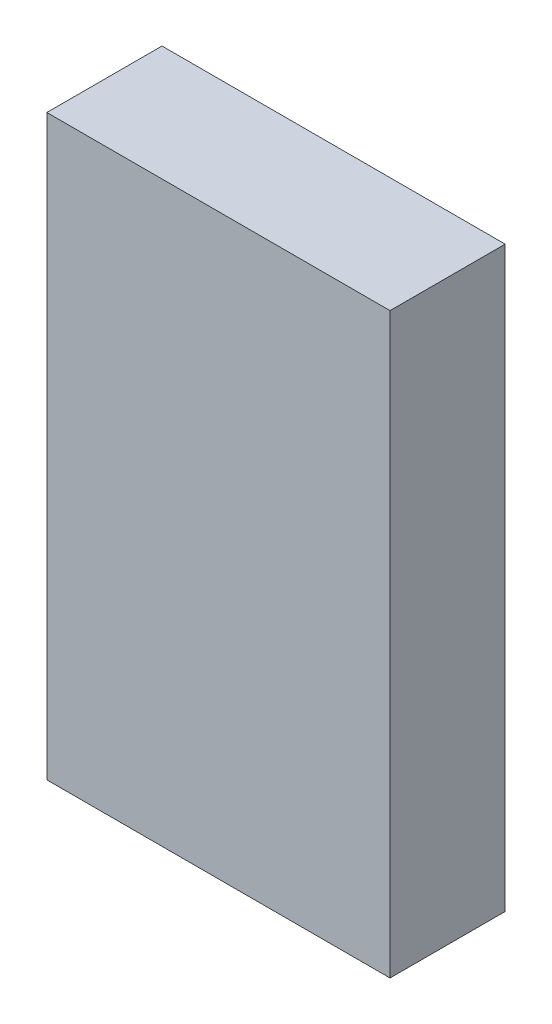
ISO-10303-21;
HEADER;
FILE_DESCRIPTION(('STEP AP214'),'2;1');
FILE_NAME('part.step','',(''),(''),'','','');
FILE_SCHEMA(('AUTOMOTIVE_DESIGN { 1 0 10303 214 1 1 1 1 }'));
ENDSEC;
DATA;
#1=APPLICATION_CONTEXT('core data for automotive mechanical design processes');
#2=APPLICATION_PROTOCOL_DEFINITION('international standard','automotive_design',2000,#1);
#3=PRODUCT_CONTEXT('',#1,'mechanical');
#4=PRODUCT('Part','Part','',(#3));
#5=PRODUCT_RELATED_PRODUCT_CATEGORY('part','',(#4));
#6=PRODUCT_DEFINITION_FORMATION('','',#4);
#7=PRODUCT_DEFINITION_CONTEXT('part definition',#1,'design');
#8=PRODUCT_DEFINITION('design','',#6,#7);
#9=PRODUCT_DEFINITION_SHAPE('','',#8);
#10=(LENGTH_UNIT() NAMED_UNIT(*) SI_UNIT(.MILLI.,.METRE.));
#11=(NAMED_UNIT(*) PLANE_ANGLE_UNIT() SI_UNIT($,.RADIAN.));
#12=(NAMED_UNIT(*) SI_UNIT($,.STERADIAN.) SOLID_ANGLE_UNIT());
#13=UNCERTAINTY_MEASURE_WITH_UNIT(LENGTH_MEASURE(1.E-05),#10,'distance_accuracy_value','');
#14=(GEOMETRIC_REPRESENTATION_CONTEXT(3) GLOBAL_UNCERTAINTY_ASSIGNED_CONTEXT((#13)) GLOBAL_UNIT_ASSIGNED_CONTEXT((#10,
#11,#12)) REPRESENTATION_CONTEXT('',''));
#15=CARTESIAN_POINT('',(0.,0.,0.));
#16=DIRECTION('',(0.,0.,1.));
#17=DIRECTION('',(1.,0.,0.));
#18=AXIS2_PLACEMENT_3D('',#15,#16,#17);
#19=CARTESIAN_POINT('',(-3.80000002,6.3999999,0.));
#20=DIRECTION('',(1.,0.,0.));
#21=DIRECTION('',(0.,-1.,0.));
#22=AXIS2_PLACEMENT_3D('',#19,#20,#21);
#23=PLANE('',#22);
#24=DIRECTION('',(0.,-1.,0.));
#25=VECTOR('',#24,1.);
#26=CARTESIAN_POINT('',(-3.80000002,6.3999999,0.));
#27=LINE('',#26,#25);
#28=CARTESIAN_POINT('',(-3.80000002,6.3999999,0.));
#29=VERTEX_POINT('',#28);
#30=CARTESIAN_POINT('',(-3.80000002,-6.3999999,0.));
#31=VERTEX_POINT('',#30);
#32=EDGE_CURVE('E11',#29,#31,#27,.T.);
#33=ORIENTED_EDGE('',*,*,#32,.T.);
#34=DIRECTION('',(0.,0.,1.));
#35=VECTOR('',#34,1.);
#36=CARTESIAN_POINT('',(-3.80000002,-6.3999999,0.));
#37=LINE('',#36,#35);
#38=CARTESIAN_POINT('',(-3.80000002,-6.3999999,2.54999998));
#39=VERTEX_POINT('',#38);
#40=EDGE_CURVE('E24',#31,#39,#37,.T.);
#41=ORIENTED_EDGE('',*,*,#40,.T.);
#42=DIRECTION('',(0.,-1.,0.));
#43=VECTOR('',#42,1.);
#44=CARTESIAN_POINT('',(-3.80000002,6.3999999,2.54999998));
#45=LINE('',#44,#43);
#46=CARTESIAN_POINT('',(-3.80000002,6.3999999,2.54999998));
#47=VERTEX_POINT('',#46);
#48=EDGE_CURVE('E87',#47,#39,#45,.T.);
#49=ORIENTED_EDGE('',*,*,#48,.F.);
#50=DIRECTION('',(0.,0.,1.));
#51=VECTOR('',#50,1.);
#52=CARTESIAN_POINT('',(-3.80000002,6.3999999,0.));
#53=LINE('',#52,#51);
#54=EDGE_CURVE('E36',#29,#47,#53,.T.);
#55=ORIENTED_EDGE('',*,*,#54,.F.);
#56=EDGE_LOOP('',(#33,#41,#49,#55));
#57=FACE_BOUND('',#56,.T.);
#58=ADVANCED_FACE('F17',(#57),#23,.F.);
#59=CARTESIAN_POINT('',(-3.80000002,-6.3999999,0.));
#60=DIRECTION('',(0.,1.,0.));
#61=DIRECTION('',(1.,0.,0.));
#62=AXIS2_PLACEMENT_3D('',#59,#60,#61);
#63=PLANE('',#62);
#64=DIRECTION('',(1.,0.,0.));
#65=VECTOR('',#64,1.);
#66=CARTESIAN_POINT('',(-3.80000002,-6.3999999,0.));
#67=LINE('',#66,#65);
#68=CARTESIAN_POINT('',(3.80000002,-6.3999999,0.));
#69=VERTEX_POINT('',#68);
#70=EDGE_CURVE('E84',#31,#69,#67,.T.);
#71=ORIENTED_EDGE('',*,*,#70,.T.);
#72=DIRECTION('',(0.,0.,1.));
#73=VECTOR('',#72,1.);
#74=CARTESIAN_POINT('',(3.80000002,-6.3999999,0.));
#75=LINE('',#74,#73);
#76=CARTESIAN_POINT('',(3.80000002,-6.3999999,2.54999998));
#77=VERTEX_POINT('',#76);
#78=EDGE_CURVE('E82',#69,#77,#75,.T.);
#79=ORIENTED_EDGE('',*,*,#78,.T.);
#80=DIRECTION('',(1.,0.,0.));
#81=VECTOR('',#80,1.);
#82=CARTESIAN_POINT('',(-3.80000002,-6.3999999,2.54999998));
#83=LINE('',#82,#81);
#84=EDGE_CURVE('E62',#39,#77,#83,.T.);
#85=ORIENTED_EDGE('',*,*,#84,.F.);
#86=ORIENTED_EDGE('',*,*,#40,.F.);
#87=EDGE_LOOP('',(#71,#79,#85,#86));
#88=FACE_BOUND('',#87,.T.);
#89=ADVANCED_FACE('F89',(#88),#63,.F.);
#90=CARTESIAN_POINT('',(3.80000002,-6.3999999,0.));
#91=DIRECTION('',(-1.,0.,0.));
#92=DIRECTION('',(0.,1.,0.));
#93=AXIS2_PLACEMENT_3D('',#90,#91,#92);
#94=PLANE('',#93);
#95=DIRECTION('',(0.,1.,0.));
#96=VECTOR('',#95,1.);
#97=CARTESIAN_POINT('',(3.80000002,-6.3999999,0.));
#98=LINE('',#97,#96);
#99=CARTESIAN_POINT('',(3.80000002,6.3999999,0.));
#100=VERTEX_POINT('',#99);
#101=EDGE_CURVE('E71',#69,#100,#98,.T.);
#102=ORIENTED_EDGE('',*,*,#101,.T.);
#103=DIRECTION('',(0.,0.,1.));
#104=VECTOR('',#103,1.);
#105=CARTESIAN_POINT('',(3.80000002,6.3999999,0.));
#106=LINE('',#105,#104);
#107=CARTESIAN_POINT('',(3.80000002,6.3999999,2.54999998));
#108=VERTEX_POINT('',#107);
#109=EDGE_CURVE('E65',#100,#108,#106,.T.);
#110=ORIENTED_EDGE('',*,*,#109,.T.);
#111=DIRECTION('',(0.,1.,0.));
#112=VECTOR('',#111,1.);
#113=CARTESIAN_POINT('',(3.80000002,-6.3999999,2.54999998));
#114=LINE('',#113,#112);
#115=EDGE_CURVE('E57',#77,#108,#114,.T.);
#116=ORIENTED_EDGE('',*,*,#115,.F.);
#117=ORIENTED_EDGE('',*,*,#78,.F.);
#118=EDGE_LOOP('',(#102,#110,#116,#117));
#119=FACE_BOUND('',#118,.T.);
#120=ADVANCED_FACE('F69',(#119),#94,.F.);
#121=CARTESIAN_POINT('',(3.80000002,6.3999999,0.));
#122=DIRECTION('',(0.,-1.,0.));
#123=DIRECTION('',(-1.,0.,0.));
#124=AXIS2_PLACEMENT_3D('',#121,#122,#123);
#125=PLANE('',#124);
#126=DIRECTION('',(-1.,0.,0.));
#127=VECTOR('',#126,1.);
#128=CARTESIAN_POINT('',(3.80000002,6.3999999,0.));
#129=LINE('',#128,#127);
#130=EDGE_CURVE('E66',#100,#29,#129,.T.);
#131=ORIENTED_EDGE('',*,*,#130,.T.);
#132=ORIENTED_EDGE('',*,*,#54,.T.);
#133=DIRECTION('',(-1.,0.,0.));
#134=VECTOR('',#133,1.);
#135=CARTESIAN_POINT('',(3.80000002,6.3999999,2.54999998));
#136=LINE('',#135,#134);
#137=EDGE_CURVE('E61',#108,#47,#136,.T.);
#138=ORIENTED_EDGE('',*,*,#137,.F.);
#139=ORIENTED_EDGE('',*,*,#109,.F.);
#140=EDGE_LOOP('',(#131,#132,#138,#139));
#141=FACE_BOUND('',#140,.T.);
#142=ADVANCED_FACE('F76',(#141),#125,.F.);
#143=CARTESIAN_POINT('',(0.,0.,0.));
#144=DIRECTION('',(0.,0.,1.));
#145=DIRECTION('',(1.,0.,0.));
#146=AXIS2_PLACEMENT_3D('',#143,#144,#145);
#147=PLANE('',#146);
#148=ORIENTED_EDGE('',*,*,#130,.F.);
#149=ORIENTED_EDGE('',*,*,#101,.F.);
#150=ORIENTED_EDGE('',*,*,#70,.F.);
#151=ORIENTED_EDGE('',*,*,#32,.F.);
#152=EDGE_LOOP('',(#148,#149,#150,#151));
#153=FACE_BOUND('',#152,.T.);
#154=ADVANCED_FACE('F91',(#153),#147,.F.);
#155=CARTESIAN_POINT('',(0.,0.,2.54999998));
#156=DIRECTION('',(0.,0.,1.));
#157=DIRECTION('',(1.,0.,0.));
#158=AXIS2_PLACEMENT_3D('',#155,#156,#157);
#159=PLANE('',#158);
#160=ORIENTED_EDGE('',*,*,#48,.T.);
#161=ORIENTED_EDGE('',*,*,#84,.T.);
#162=ORIENTED_EDGE('',*,*,#115,.T.);
#163=ORIENTED_EDGE('',*,*,#137,.T.);
#164=EDGE_LOOP('',(#160,#161,#162,#163));
#165=FACE_BOUND('',#164,.T.);
#166=ADVANCED_FACE('F59',(#165),#159,.T.);
#167=CLOSED_SHELL('',(#58,#89,#120,#142,#154,#166));
#168=MANIFOLD_SOLID_BREP('B1',#167);
#169=ADVANCED_BREP_SHAPE_REPRESENTATION('',(#18,#168),#14);
#170=SHAPE_DEFINITION_REPRESENTATION(#9,#169);
ENDSEC;
END-ISO-10303-21;
